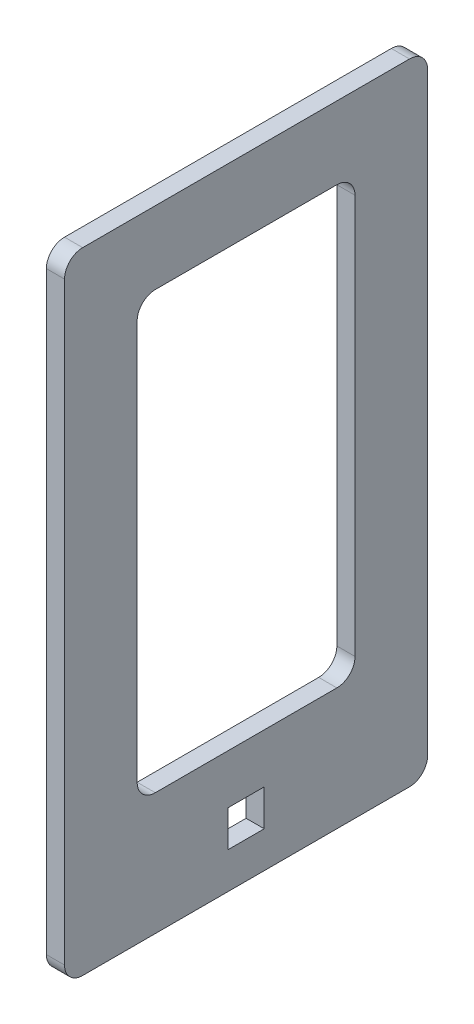
ISO-10303-21;
HEADER;
FILE_DESCRIPTION(('STEP AP214'),'2;1');
FILE_NAME('part.step','',(''),(''),'','','');
FILE_SCHEMA(('AUTOMOTIVE_DESIGN { 1 0 10303 214 1 1 1 1 }'));
ENDSEC;
DATA;
#1=APPLICATION_CONTEXT('core data for automotive mechanical design processes');
#2=APPLICATION_PROTOCOL_DEFINITION('international standard','automotive_design',2000,#1);
#3=PRODUCT_CONTEXT('',#1,'mechanical');
#4=PRODUCT('Part','Part','',(#3));
#5=PRODUCT_RELATED_PRODUCT_CATEGORY('part','',(#4));
#6=PRODUCT_DEFINITION_FORMATION('','',#4);
#7=PRODUCT_DEFINITION_CONTEXT('part definition',#1,'design');
#8=PRODUCT_DEFINITION('design','',#6,#7);
#9=PRODUCT_DEFINITION_SHAPE('','',#8);
#10=(LENGTH_UNIT() NAMED_UNIT(*) SI_UNIT(.MILLI.,.METRE.));
#11=(NAMED_UNIT(*) PLANE_ANGLE_UNIT() SI_UNIT($,.RADIAN.));
#12=(NAMED_UNIT(*) SI_UNIT($,.STERADIAN.) SOLID_ANGLE_UNIT());
#13=UNCERTAINTY_MEASURE_WITH_UNIT(LENGTH_MEASURE(1.E-05),#10,'distance_accuracy_value','');
#14=(GEOMETRIC_REPRESENTATION_CONTEXT(3) GLOBAL_UNCERTAINTY_ASSIGNED_CONTEXT((#13)) GLOBAL_UNIT_ASSIGNED_CONTEXT((#10,
#11,#12)) REPRESENTATION_CONTEXT('',''));
#15=CARTESIAN_POINT('',(0.,0.,0.));
#16=DIRECTION('',(0.,0.,1.));
#17=DIRECTION('',(1.,0.,0.));
#18=AXIS2_PLACEMENT_3D('',#15,#16,#17);
#19=CARTESIAN_POINT('',(6.35,-103.886,57.15));
#20=DIRECTION('',(-1.,0.,0.));
#21=DIRECTION('',(0.,0.,1.));
#22=AXIS2_PLACEMENT_3D('',#19,#20,#21);
#23=PLANE('',#22);
#24=DIRECTION('',(0.,0.,1.));
#25=VECTOR('',#24,1.);
#26=CARTESIAN_POINT('',(6.35,-84.836,6.35000000000005));
#27=LINE('',#26,#25);
#28=CARTESIAN_POINT('',(6.35,-84.836,-6.34999999999995));
#29=VERTEX_POINT('',#28);
#30=CARTESIAN_POINT('',(6.35,-84.836,6.35000000000005));
#31=VERTEX_POINT('',#30);
#32=EDGE_CURVE('E201',#29,#31,#27,.T.);
#33=ORIENTED_EDGE('',*,*,#32,.F.);
#34=DIRECTION('',(0.,1.,0.));
#35=VECTOR('',#34,1.);
#36=CARTESIAN_POINT('',(6.35,-97.536,-6.34999999999995));
#37=LINE('',#36,#35);
#38=CARTESIAN_POINT('',(6.35,-97.536,-6.34999999999995));
#39=VERTEX_POINT('',#38);
#40=EDGE_CURVE('E55',#39,#29,#37,.T.);
#41=ORIENTED_EDGE('',*,*,#40,.F.);
#42=DIRECTION('',(0.,0.,-1.));
#43=VECTOR('',#42,1.);
#44=CARTESIAN_POINT('',(6.35,-97.536,6.35000000000005));
#45=LINE('',#44,#43);
#46=CARTESIAN_POINT('',(6.35,-97.536,6.35000000000005));
#47=VERTEX_POINT('',#46);
#48=EDGE_CURVE('E191',#47,#39,#45,.T.);
#49=ORIENTED_EDGE('',*,*,#48,.F.);
#50=DIRECTION('',(0.,-1.,0.));
#51=VECTOR('',#50,1.);
#52=CARTESIAN_POINT('',(6.35,-97.536,6.35000000000005));
#53=LINE('',#52,#51);
#54=EDGE_CURVE('E209',#31,#47,#53,.T.);
#55=ORIENTED_EDGE('',*,*,#54,.F.);
#56=EDGE_LOOP('',(#33,#41,#49,#55));
#57=FACE_BOUND('',#56,.T.);
#58=CARTESIAN_POINT('',(6.35,-103.886,57.15));
#59=DIRECTION('',(1.,0.,0.));
#60=DIRECTION('',(0.,0.,1.));
#61=AXIS2_PLACEMENT_3D('',#58,#59,#60);
#62=CIRCLE('',#61,6.35);
#63=CARTESIAN_POINT('',(6.35,-103.886,63.5));
#64=VERTEX_POINT('',#63);
#65=CARTESIAN_POINT('',(6.35,-110.236,57.15));
#66=VERTEX_POINT('',#65);
#67=EDGE_CURVE('E306',#64,#66,#62,.T.);
#68=ORIENTED_EDGE('',*,*,#67,.T.);
#69=DIRECTION('',(0.,0.,-1.));
#70=VECTOR('',#69,1.);
#71=CARTESIAN_POINT('',(6.35,-110.236,57.15));
#72=LINE('',#71,#70);
#73=CARTESIAN_POINT('',(6.35,-110.236,-57.15));
#74=VERTEX_POINT('',#73);
#75=EDGE_CURVE('E310',#66,#74,#72,.T.);
#76=ORIENTED_EDGE('',*,*,#75,.T.);
#77=CARTESIAN_POINT('',(6.35,-103.886,-57.15));
#78=DIRECTION('',(1.,0.,0.));
#79=DIRECTION('',(0.,0.,1.));
#80=AXIS2_PLACEMENT_3D('',#77,#78,#79);
#81=CIRCLE('',#80,6.35);
#82=CARTESIAN_POINT('',(6.35,-103.886,-63.5));
#83=VERTEX_POINT('',#82);
#84=EDGE_CURVE('E314',#74,#83,#81,.T.);
#85=ORIENTED_EDGE('',*,*,#84,.T.);
#86=DIRECTION('',(0.,1.,0.));
#87=VECTOR('',#86,1.);
#88=CARTESIAN_POINT('',(6.35,-103.886,-63.5));
#89=LINE('',#88,#87);
#90=CARTESIAN_POINT('',(6.35,103.886,-63.5));
#91=VERTEX_POINT('',#90);
#92=EDGE_CURVE('E317',#83,#91,#89,.T.);
#93=ORIENTED_EDGE('',*,*,#92,.T.);
#94=CARTESIAN_POINT('',(6.35,103.886,-57.15));
#95=DIRECTION('',(1.,0.,0.));
#96=DIRECTION('',(0.,0.,-1.));
#97=AXIS2_PLACEMENT_3D('',#94,#95,#96);
#98=CIRCLE('',#97,6.35);
#99=CARTESIAN_POINT('',(6.35,110.236,-57.15));
#100=VERTEX_POINT('',#99);
#101=EDGE_CURVE('E320',#91,#100,#98,.T.);
#102=ORIENTED_EDGE('',*,*,#101,.T.);
#103=DIRECTION('',(0.,0.,1.));
#104=VECTOR('',#103,1.);
#105=CARTESIAN_POINT('',(6.35,110.236,57.15));
#106=LINE('',#105,#104);
#107=CARTESIAN_POINT('',(6.35,110.236,57.15));
#108=VERTEX_POINT('',#107);
#109=EDGE_CURVE('E323',#100,#108,#106,.T.);
#110=ORIENTED_EDGE('',*,*,#109,.T.);
#111=CARTESIAN_POINT('',(6.35,103.886,57.15));
#112=DIRECTION('',(1.,0.,0.));
#113=DIRECTION('',(0.,0.,1.));
#114=AXIS2_PLACEMENT_3D('',#111,#112,#113);
#115=CIRCLE('',#114,6.35);
#116=CARTESIAN_POINT('',(6.35,103.886,63.5));
#117=VERTEX_POINT('',#116);
#118=EDGE_CURVE('E326',#108,#117,#115,.T.);
#119=ORIENTED_EDGE('',*,*,#118,.T.);
#120=DIRECTION('',(0.,-1.,0.));
#121=VECTOR('',#120,1.);
#122=CARTESIAN_POINT('',(6.35,-103.886,63.5));
#123=LINE('',#122,#121);
#124=EDGE_CURVE('E329',#117,#64,#123,.T.);
#125=ORIENTED_EDGE('',*,*,#124,.T.);
#126=EDGE_LOOP('',(#68,#76,#85,#93,#102,#110,#119,#125));
#127=FACE_BOUND('',#126,.T.);
#128=CARTESIAN_POINT('',(6.35,-61.214,-31.75));
#129=DIRECTION('',(1.,0.,0.));
#130=DIRECTION('',(0.,0.,-1.));
#131=AXIS2_PLACEMENT_3D('',#128,#129,#130);
#132=CIRCLE('',#131,6.35000000000001);
#133=CARTESIAN_POINT('',(6.35,-67.564,-31.75));
#134=VERTEX_POINT('',#133);
#135=CARTESIAN_POINT('',(6.35,-61.214,-38.1));
#136=VERTEX_POINT('',#135);
#137=EDGE_CURVE('E223',#134,#136,#132,.T.);
#138=ORIENTED_EDGE('',*,*,#137,.F.);
#139=DIRECTION('',(0.,0.,-1.));
#140=VECTOR('',#139,1.);
#141=CARTESIAN_POINT('',(6.35,-67.564,31.75));
#142=LINE('',#141,#140);
#143=CARTESIAN_POINT('',(6.35,-67.564,31.75));
#144=VERTEX_POINT('',#143);
#145=EDGE_CURVE('E246',#144,#134,#142,.T.);
#146=ORIENTED_EDGE('',*,*,#145,.F.);
#147=CARTESIAN_POINT('',(6.35,-61.214,31.75));
#148=DIRECTION('',(1.,0.,0.));
#149=DIRECTION('',(0.,0.,1.));
#150=AXIS2_PLACEMENT_3D('',#147,#148,#149);
#151=CIRCLE('',#150,6.35);
#152=CARTESIAN_POINT('',(6.35,-61.214,38.1));
#153=VERTEX_POINT('',#152);
#154=EDGE_CURVE('E242',#153,#144,#151,.T.);
#155=ORIENTED_EDGE('',*,*,#154,.F.);
#156=DIRECTION('',(0.,-1.,0.));
#157=VECTOR('',#156,1.);
#158=CARTESIAN_POINT('',(6.35,-61.214,38.1));
#159=LINE('',#158,#157);
#160=CARTESIAN_POINT('',(6.35,78.486,38.1));
#161=VERTEX_POINT('',#160);
#162=EDGE_CURVE('E239',#161,#153,#159,.T.);
#163=ORIENTED_EDGE('',*,*,#162,.F.);
#164=CARTESIAN_POINT('',(6.35,78.486,31.75));
#165=DIRECTION('',(1.,0.,0.));
#166=DIRECTION('',(0.,0.,1.));
#167=AXIS2_PLACEMENT_3D('',#164,#165,#166);
#168=CIRCLE('',#167,6.35);
#169=CARTESIAN_POINT('',(6.35,84.836,31.75));
#170=VERTEX_POINT('',#169);
#171=EDGE_CURVE('E236',#170,#161,#168,.T.);
#172=ORIENTED_EDGE('',*,*,#171,.F.);
#173=DIRECTION('',(0.,0.,1.));
#174=VECTOR('',#173,1.);
#175=CARTESIAN_POINT('',(6.35,84.836,31.75));
#176=LINE('',#175,#174);
#177=CARTESIAN_POINT('',(6.35,84.836,-31.75));
#178=VERTEX_POINT('',#177);
#179=EDGE_CURVE('E233',#178,#170,#176,.T.);
#180=ORIENTED_EDGE('',*,*,#179,.F.);
#181=CARTESIAN_POINT('',(6.35,78.486,-31.75));
#182=DIRECTION('',(1.,0.,0.));
#183=DIRECTION('',(0.,0.,1.));
#184=AXIS2_PLACEMENT_3D('',#181,#182,#183);
#185=CIRCLE('',#184,6.35);
#186=CARTESIAN_POINT('',(6.35,78.486,-38.1));
#187=VERTEX_POINT('',#186);
#188=EDGE_CURVE('E230',#187,#178,#185,.T.);
#189=ORIENTED_EDGE('',*,*,#188,.F.);
#190=DIRECTION('',(0.,1.,0.));
#191=VECTOR('',#190,1.);
#192=CARTESIAN_POINT('',(6.35,-61.214,-38.1));
#193=LINE('',#192,#191);
#194=EDGE_CURVE('E226',#136,#187,#193,.T.);
#195=ORIENTED_EDGE('',*,*,#194,.F.);
#196=EDGE_LOOP('',(#138,#146,#155,#163,#172,#180,#189,#195));
#197=FACE_BOUND('',#196,.T.);
#198=ADVANCED_FACE('F39',(#57,#127,#197),#23,.F.);
#199=CARTESIAN_POINT('',(0.,-103.886,57.15));
#200=DIRECTION('',(-1.,0.,0.));
#201=DIRECTION('',(0.,0.,1.));
#202=AXIS2_PLACEMENT_3D('',#199,#200,#201);
#203=PLANE('',#202);
#204=DIRECTION('',(0.,1.,0.));
#205=VECTOR('',#204,1.);
#206=CARTESIAN_POINT('',(0.,-97.536,-6.34999999999995));
#207=LINE('',#206,#205);
#208=CARTESIAN_POINT('',(0.,-97.536,-6.34999999999995));
#209=VERTEX_POINT('',#208);
#210=CARTESIAN_POINT('',(0.,-84.836,-6.34999999999995));
#211=VERTEX_POINT('',#210);
#212=EDGE_CURVE('E188',#209,#211,#207,.T.);
#213=ORIENTED_EDGE('',*,*,#212,.T.);
#214=DIRECTION('',(0.,0.,1.));
#215=VECTOR('',#214,1.);
#216=CARTESIAN_POINT('',(0.,-84.836,6.35000000000005));
#217=LINE('',#216,#215);
#218=CARTESIAN_POINT('',(0.,-84.836,6.35000000000004));
#219=VERTEX_POINT('',#218);
#220=EDGE_CURVE('E176',#211,#219,#217,.T.);
#221=ORIENTED_EDGE('',*,*,#220,.T.);
#222=DIRECTION('',(0.,-1.,0.));
#223=VECTOR('',#222,1.);
#224=CARTESIAN_POINT('',(0.,-97.536,6.35000000000005));
#225=LINE('',#224,#223);
#226=CARTESIAN_POINT('',(0.,-97.536,6.35000000000005));
#227=VERTEX_POINT('',#226);
#228=EDGE_CURVE('E203',#219,#227,#225,.T.);
#229=ORIENTED_EDGE('',*,*,#228,.T.);
#230=DIRECTION('',(0.,0.,-1.));
#231=VECTOR('',#230,1.);
#232=CARTESIAN_POINT('',(0.,-97.536,6.35000000000005));
#233=LINE('',#232,#231);
#234=EDGE_CURVE('E196',#227,#209,#233,.T.);
#235=ORIENTED_EDGE('',*,*,#234,.T.);
#236=EDGE_LOOP('',(#213,#221,#229,#235));
#237=FACE_BOUND('',#236,.T.);
#238=CARTESIAN_POINT('',(0.,-103.886,57.15));
#239=DIRECTION('',(1.,0.,0.));
#240=DIRECTION('',(0.,0.,1.));
#241=AXIS2_PLACEMENT_3D('',#238,#239,#240);
#242=CIRCLE('',#241,6.35);
#243=CARTESIAN_POINT('',(0.,-103.886,63.5));
#244=VERTEX_POINT('',#243);
#245=CARTESIAN_POINT('',(0.,-110.236,57.15));
#246=VERTEX_POINT('',#245);
#247=EDGE_CURVE('E305',#244,#246,#242,.T.);
#248=ORIENTED_EDGE('',*,*,#247,.F.);
#249=DIRECTION('',(0.,-1.,0.));
#250=VECTOR('',#249,1.);
#251=CARTESIAN_POINT('',(0.,-103.886,63.5));
#252=LINE('',#251,#250);
#253=CARTESIAN_POINT('',(0.,103.886,63.5));
#254=VERTEX_POINT('',#253);
#255=EDGE_CURVE('E311',#254,#244,#252,.T.);
#256=ORIENTED_EDGE('',*,*,#255,.F.);
#257=CARTESIAN_POINT('',(0.,103.886,57.15));
#258=DIRECTION('',(1.,0.,0.));
#259=DIRECTION('',(0.,0.,1.));
#260=AXIS2_PLACEMENT_3D('',#257,#258,#259);
#261=CIRCLE('',#260,6.35);
#262=CARTESIAN_POINT('',(0.,110.236,57.15));
#263=VERTEX_POINT('',#262);
#264=EDGE_CURVE('E351',#263,#254,#261,.T.);
#265=ORIENTED_EDGE('',*,*,#264,.F.);
#266=DIRECTION('',(0.,0.,1.));
#267=VECTOR('',#266,1.);
#268=CARTESIAN_POINT('',(0.,110.236,57.15));
#269=LINE('',#268,#267);
#270=CARTESIAN_POINT('',(0.,110.236,-57.15));
#271=VERTEX_POINT('',#270);
#272=EDGE_CURVE('E348',#271,#263,#269,.T.);
#273=ORIENTED_EDGE('',*,*,#272,.F.);
#274=CARTESIAN_POINT('',(0.,103.886,-57.15));
#275=DIRECTION('',(1.,0.,0.));
#276=DIRECTION('',(0.,0.,-1.));
#277=AXIS2_PLACEMENT_3D('',#274,#275,#276);
#278=CIRCLE('',#277,6.35);
#279=CARTESIAN_POINT('',(0.,103.886,-63.5));
#280=VERTEX_POINT('',#279);
#281=EDGE_CURVE('E345',#280,#271,#278,.T.);
#282=ORIENTED_EDGE('',*,*,#281,.F.);
#283=DIRECTION('',(0.,1.,0.));
#284=VECTOR('',#283,1.);
#285=CARTESIAN_POINT('',(0.,-103.886,-63.5));
#286=LINE('',#285,#284);
#287=CARTESIAN_POINT('',(0.,-103.886,-63.5));
#288=VERTEX_POINT('',#287);
#289=EDGE_CURVE('E342',#288,#280,#286,.T.);
#290=ORIENTED_EDGE('',*,*,#289,.F.);
#291=CARTESIAN_POINT('',(0.,-103.886,-57.15));
#292=DIRECTION('',(1.,0.,0.));
#293=DIRECTION('',(0.,0.,1.));
#294=AXIS2_PLACEMENT_3D('',#291,#292,#293);
#295=CIRCLE('',#294,6.35);
#296=CARTESIAN_POINT('',(0.,-110.236,-57.15));
#297=VERTEX_POINT('',#296);
#298=EDGE_CURVE('E339',#297,#288,#295,.T.);
#299=ORIENTED_EDGE('',*,*,#298,.F.);
#300=DIRECTION('',(0.,0.,-1.));
#301=VECTOR('',#300,1.);
#302=CARTESIAN_POINT('',(0.,-110.236,57.15));
#303=LINE('',#302,#301);
#304=EDGE_CURVE('E336',#246,#297,#303,.T.);
#305=ORIENTED_EDGE('',*,*,#304,.F.);
#306=EDGE_LOOP('',(#248,#256,#265,#273,#282,#290,#299,#305));
#307=FACE_BOUND('',#306,.T.);
#308=DIRECTION('',(0.,0.,-1.));
#309=VECTOR('',#308,1.);
#310=CARTESIAN_POINT('',(0.,-67.564,31.75));
#311=LINE('',#310,#309);
#312=CARTESIAN_POINT('',(0.,-67.564,31.75));
#313=VERTEX_POINT('',#312);
#314=CARTESIAN_POINT('',(0.,-67.564,-31.75));
#315=VERTEX_POINT('',#314);
#316=EDGE_CURVE('E227',#313,#315,#311,.T.);
#317=ORIENTED_EDGE('',*,*,#316,.T.);
#318=CARTESIAN_POINT('',(0.,-61.214,-31.75));
#319=DIRECTION('',(1.,0.,0.));
#320=DIRECTION('',(0.,0.,-1.));
#321=AXIS2_PLACEMENT_3D('',#318,#319,#320);
#322=CIRCLE('',#321,6.35000000000001);
#323=CARTESIAN_POINT('',(0.,-61.214,-38.1));
#324=VERTEX_POINT('',#323);
#325=EDGE_CURVE('E184',#315,#324,#322,.T.);
#326=ORIENTED_EDGE('',*,*,#325,.T.);
#327=DIRECTION('',(0.,1.,0.));
#328=VECTOR('',#327,1.);
#329=CARTESIAN_POINT('',(0.,-61.214,-38.1));
#330=LINE('',#329,#328);
#331=CARTESIAN_POINT('',(0.,78.486,-38.1));
#332=VERTEX_POINT('',#331);
#333=EDGE_CURVE('E253',#324,#332,#330,.T.);
#334=ORIENTED_EDGE('',*,*,#333,.T.);
#335=CARTESIAN_POINT('',(0.,78.486,-31.75));
#336=DIRECTION('',(1.,0.,0.));
#337=DIRECTION('',(0.,0.,1.));
#338=AXIS2_PLACEMENT_3D('',#335,#336,#337);
#339=CIRCLE('',#338,6.35);
#340=CARTESIAN_POINT('',(0.,84.836,-31.75));
#341=VERTEX_POINT('',#340);
#342=EDGE_CURVE('E257',#332,#341,#339,.T.);
#343=ORIENTED_EDGE('',*,*,#342,.T.);
#344=DIRECTION('',(0.,0.,1.));
#345=VECTOR('',#344,1.);
#346=CARTESIAN_POINT('',(0.,84.836,31.75));
#347=LINE('',#346,#345);
#348=CARTESIAN_POINT('',(0.,84.836,31.75));
#349=VERTEX_POINT('',#348);
#350=EDGE_CURVE('E261',#341,#349,#347,.T.);
#351=ORIENTED_EDGE('',*,*,#350,.T.);
#352=CARTESIAN_POINT('',(0.,78.486,31.75));
#353=DIRECTION('',(1.,0.,0.));
#354=DIRECTION('',(0.,0.,1.));
#355=AXIS2_PLACEMENT_3D('',#352,#353,#354);
#356=CIRCLE('',#355,6.35);
#357=CARTESIAN_POINT('',(0.,78.486,38.1));
#358=VERTEX_POINT('',#357);
#359=EDGE_CURVE('E265',#349,#358,#356,.T.);
#360=ORIENTED_EDGE('',*,*,#359,.T.);
#361=DIRECTION('',(0.,-1.,0.));
#362=VECTOR('',#361,1.);
#363=CARTESIAN_POINT('',(0.,-61.214,38.1));
#364=LINE('',#363,#362);
#365=CARTESIAN_POINT('',(0.,-61.214,38.1));
#366=VERTEX_POINT('',#365);
#367=EDGE_CURVE('E269',#358,#366,#364,.T.);
#368=ORIENTED_EDGE('',*,*,#367,.T.);
#369=CARTESIAN_POINT('',(0.,-61.214,31.75));
#370=DIRECTION('',(1.,0.,0.));
#371=DIRECTION('',(0.,0.,1.));
#372=AXIS2_PLACEMENT_3D('',#369,#370,#371);
#373=CIRCLE('',#372,6.35);
#374=EDGE_CURVE('E273',#366,#313,#373,.T.);
#375=ORIENTED_EDGE('',*,*,#374,.T.);
#376=EDGE_LOOP('',(#317,#326,#334,#343,#351,#360,#368,#375));
#377=FACE_BOUND('',#376,.T.);
#378=ADVANCED_FACE('F194',(#237,#307,#377),#203,.T.);
#379=CARTESIAN_POINT('',(6.35,-103.886,57.15));
#380=DIRECTION('',(-1.,0.,0.));
#381=DIRECTION('',(0.,0.,1.));
#382=AXIS2_PLACEMENT_3D('',#379,#380,#381);
#383=CYLINDRICAL_SURFACE('',#382,6.35);
#384=ORIENTED_EDGE('',*,*,#247,.T.);
#385=DIRECTION('',(-1.,0.,0.));
#386=VECTOR('',#385,1.);
#387=CARTESIAN_POINT('',(6.35,-110.236,57.15));
#388=LINE('',#387,#386);
#389=EDGE_CURVE('E11',#66,#246,#388,.T.);
#390=ORIENTED_EDGE('',*,*,#389,.F.);
#391=ORIENTED_EDGE('',*,*,#67,.F.);
#392=DIRECTION('',(-1.,0.,0.));
#393=VECTOR('',#392,1.);
#394=CARTESIAN_POINT('',(6.35,-103.886,63.5));
#395=LINE('',#394,#393);
#396=EDGE_CURVE('E332',#64,#244,#395,.T.);
#397=ORIENTED_EDGE('',*,*,#396,.T.);
#398=EDGE_LOOP('',(#384,#390,#391,#397));
#399=FACE_BOUND('',#398,.T.);
#400=ADVANCED_FACE('F41',(#399),#383,.T.);
#401=CARTESIAN_POINT('',(6.35,-110.236,57.15));
#402=DIRECTION('',(0.,1.,0.));
#403=DIRECTION('',(0.,0.,1.));
#404=AXIS2_PLACEMENT_3D('',#401,#402,#403);
#405=PLANE('',#404);
#406=ORIENTED_EDGE('',*,*,#304,.T.);
#407=DIRECTION('',(-1.,0.,0.));
#408=VECTOR('',#407,1.);
#409=CARTESIAN_POINT('',(6.35,-110.236,-57.15));
#410=LINE('',#409,#408);
#411=EDGE_CURVE('E48',#74,#297,#410,.T.);
#412=ORIENTED_EDGE('',*,*,#411,.F.);
#413=ORIENTED_EDGE('',*,*,#75,.F.);
#414=ORIENTED_EDGE('',*,*,#389,.T.);
#415=EDGE_LOOP('',(#406,#412,#413,#414));
#416=FACE_BOUND('',#415,.T.);
#417=ADVANCED_FACE('F406',(#416),#405,.F.);
#418=CARTESIAN_POINT('',(6.35,-103.886,-57.15));
#419=DIRECTION('',(-1.,0.,0.));
#420=DIRECTION('',(0.,0.,1.));
#421=AXIS2_PLACEMENT_3D('',#418,#419,#420);
#422=CYLINDRICAL_SURFACE('',#421,6.35);
#423=ORIENTED_EDGE('',*,*,#298,.T.);
#424=DIRECTION('',(-1.,0.,0.));
#425=VECTOR('',#424,1.);
#426=CARTESIAN_POINT('',(6.35,-103.886,-63.5));
#427=LINE('',#426,#425);
#428=EDGE_CURVE('E375',#83,#288,#427,.T.);
#429=ORIENTED_EDGE('',*,*,#428,.F.);
#430=ORIENTED_EDGE('',*,*,#84,.F.);
#431=ORIENTED_EDGE('',*,*,#411,.T.);
#432=EDGE_LOOP('',(#423,#429,#430,#431));
#433=FACE_BOUND('',#432,.T.);
#434=ADVANCED_FACE('F384',(#433),#422,.T.);
#435=CARTESIAN_POINT('',(6.35,-103.886,-63.5));
#436=DIRECTION('',(0.,0.,1.));
#437=DIRECTION('',(1.,0.,0.));
#438=AXIS2_PLACEMENT_3D('',#435,#436,#437);
#439=PLANE('',#438);
#440=ORIENTED_EDGE('',*,*,#289,.T.);
#441=DIRECTION('',(-1.,0.,0.));
#442=VECTOR('',#441,1.);
#443=CARTESIAN_POINT('',(6.35,103.886,-63.5));
#444=LINE('',#443,#442);
#445=EDGE_CURVE('E371',#91,#280,#444,.T.);
#446=ORIENTED_EDGE('',*,*,#445,.F.);
#447=ORIENTED_EDGE('',*,*,#92,.F.);
#448=ORIENTED_EDGE('',*,*,#428,.T.);
#449=EDGE_LOOP('',(#440,#446,#447,#448));
#450=FACE_BOUND('',#449,.T.);
#451=ADVANCED_FACE('F394',(#450),#439,.F.);
#452=CARTESIAN_POINT('',(6.35,103.886,-57.15));
#453=DIRECTION('',(-1.,0.,0.));
#454=DIRECTION('',(0.,0.,1.));
#455=AXIS2_PLACEMENT_3D('',#452,#453,#454);
#456=CYLINDRICAL_SURFACE('',#455,6.35);
#457=ORIENTED_EDGE('',*,*,#281,.T.);
#458=DIRECTION('',(-1.,0.,0.));
#459=VECTOR('',#458,1.);
#460=CARTESIAN_POINT('',(6.35,110.236,-57.15));
#461=LINE('',#460,#459);
#462=EDGE_CURVE('E367',#100,#271,#461,.T.);
#463=ORIENTED_EDGE('',*,*,#462,.F.);
#464=ORIENTED_EDGE('',*,*,#101,.F.);
#465=ORIENTED_EDGE('',*,*,#445,.T.);
#466=EDGE_LOOP('',(#457,#463,#464,#465));
#467=FACE_BOUND('',#466,.T.);
#468=ADVANCED_FACE('F398',(#467),#456,.T.);
#469=CARTESIAN_POINT('',(6.35,110.236,57.15));
#470=DIRECTION('',(0.,-1.,0.));
#471=DIRECTION('',(0.,0.,-1.));
#472=AXIS2_PLACEMENT_3D('',#469,#470,#471);
#473=PLANE('',#472);
#474=ORIENTED_EDGE('',*,*,#272,.T.);
#475=DIRECTION('',(-1.,0.,0.));
#476=VECTOR('',#475,1.);
#477=CARTESIAN_POINT('',(6.35,110.236,57.15));
#478=LINE('',#477,#476);
#479=EDGE_CURVE('E363',#108,#263,#478,.T.);
#480=ORIENTED_EDGE('',*,*,#479,.F.);
#481=ORIENTED_EDGE('',*,*,#109,.F.);
#482=ORIENTED_EDGE('',*,*,#462,.T.);
#483=EDGE_LOOP('',(#474,#480,#481,#482));
#484=FACE_BOUND('',#483,.T.);
#485=ADVANCED_FACE('F419',(#484),#473,.F.);
#486=CARTESIAN_POINT('',(6.35,103.886,57.15));
#487=DIRECTION('',(-1.,0.,0.));
#488=DIRECTION('',(0.,0.,1.));
#489=AXIS2_PLACEMENT_3D('',#486,#487,#488);
#490=CYLINDRICAL_SURFACE('',#489,6.35);
#491=ORIENTED_EDGE('',*,*,#264,.T.);
#492=DIRECTION('',(-1.,0.,0.));
#493=VECTOR('',#492,1.);
#494=CARTESIAN_POINT('',(6.35,103.886,63.5));
#495=LINE('',#494,#493);
#496=EDGE_CURVE('E359',#117,#254,#495,.T.);
#497=ORIENTED_EDGE('',*,*,#496,.F.);
#498=ORIENTED_EDGE('',*,*,#118,.F.);
#499=ORIENTED_EDGE('',*,*,#479,.T.);
#500=EDGE_LOOP('',(#491,#497,#498,#499));
#501=FACE_BOUND('',#500,.T.);
#502=ADVANCED_FACE('F417',(#501),#490,.T.);
#503=CARTESIAN_POINT('',(6.35,-103.886,63.5));
#504=DIRECTION('',(0.,0.,-1.));
#505=DIRECTION('',(-1.,0.,0.));
#506=AXIS2_PLACEMENT_3D('',#503,#504,#505);
#507=PLANE('',#506);
#508=ORIENTED_EDGE('',*,*,#255,.T.);
#509=ORIENTED_EDGE('',*,*,#396,.F.);
#510=ORIENTED_EDGE('',*,*,#124,.F.);
#511=ORIENTED_EDGE('',*,*,#496,.T.);
#512=EDGE_LOOP('',(#508,#509,#510,#511));
#513=FACE_BOUND('',#512,.T.);
#514=ADVANCED_FACE('F412',(#513),#507,.F.);
#515=CARTESIAN_POINT('',(6.35,-61.214,-31.75));
#516=DIRECTION('',(-1.,0.,0.));
#517=DIRECTION('',(0.,0.,1.));
#518=AXIS2_PLACEMENT_3D('',#515,#516,#517);
#519=CYLINDRICAL_SURFACE('',#518,6.35000000000001);
#520=ORIENTED_EDGE('',*,*,#325,.F.);
#521=DIRECTION('',(-1.,0.,0.));
#522=VECTOR('',#521,1.);
#523=CARTESIAN_POINT('',(6.35,-67.564,-31.75));
#524=LINE('',#523,#522);
#525=EDGE_CURVE('E249',#134,#315,#524,.T.);
#526=ORIENTED_EDGE('',*,*,#525,.F.);
#527=ORIENTED_EDGE('',*,*,#137,.T.);
#528=DIRECTION('',(-1.,0.,0.));
#529=VECTOR('',#528,1.);
#530=CARTESIAN_POINT('',(6.35,-61.214,-38.1));
#531=LINE('',#530,#529);
#532=EDGE_CURVE('E301',#136,#324,#531,.T.);
#533=ORIENTED_EDGE('',*,*,#532,.T.);
#534=EDGE_LOOP('',(#520,#526,#527,#533));
#535=FACE_BOUND('',#534,.T.);
#536=ADVANCED_FACE('F436',(#535),#519,.F.);
#537=CARTESIAN_POINT('',(6.35,-61.214,-38.1));
#538=DIRECTION('',(0.,0.,1.));
#539=DIRECTION('',(0.,-1.,0.));
#540=AXIS2_PLACEMENT_3D('',#537,#538,#539);
#541=PLANE('',#540);
#542=ORIENTED_EDGE('',*,*,#333,.F.);
#543=ORIENTED_EDGE('',*,*,#532,.F.);
#544=ORIENTED_EDGE('',*,*,#194,.T.);
#545=DIRECTION('',(-1.,0.,0.));
#546=VECTOR('',#545,1.);
#547=CARTESIAN_POINT('',(6.35,78.486,-38.1));
#548=LINE('',#547,#546);
#549=EDGE_CURVE('E298',#187,#332,#548,.T.);
#550=ORIENTED_EDGE('',*,*,#549,.T.);
#551=EDGE_LOOP('',(#542,#543,#544,#550));
#552=FACE_BOUND('',#551,.T.);
#553=ADVANCED_FACE('F443',(#552),#541,.T.);
#554=CARTESIAN_POINT('',(6.35,78.486,-31.75));
#555=DIRECTION('',(-1.,0.,0.));
#556=DIRECTION('',(0.,0.,1.));
#557=AXIS2_PLACEMENT_3D('',#554,#555,#556);
#558=CYLINDRICAL_SURFACE('',#557,6.35);
#559=ORIENTED_EDGE('',*,*,#342,.F.);
#560=ORIENTED_EDGE('',*,*,#549,.F.);
#561=ORIENTED_EDGE('',*,*,#188,.T.);
#562=DIRECTION('',(-1.,0.,0.));
#563=VECTOR('',#562,1.);
#564=CARTESIAN_POINT('',(6.35,84.836,-31.75));
#565=LINE('',#564,#563);
#566=EDGE_CURVE('E295',#178,#341,#565,.T.);
#567=ORIENTED_EDGE('',*,*,#566,.T.);
#568=EDGE_LOOP('',(#559,#560,#561,#567));
#569=FACE_BOUND('',#568,.T.);
#570=ADVANCED_FACE('F448',(#569),#558,.F.);
#571=CARTESIAN_POINT('',(6.35,84.836,31.75));
#572=DIRECTION('',(0.,-1.,0.));
#573=DIRECTION('',(0.,0.,-1.));
#574=AXIS2_PLACEMENT_3D('',#571,#572,#573);
#575=PLANE('',#574);
#576=ORIENTED_EDGE('',*,*,#350,.F.);
#577=ORIENTED_EDGE('',*,*,#566,.F.);
#578=ORIENTED_EDGE('',*,*,#179,.T.);
#579=DIRECTION('',(-1.,0.,0.));
#580=VECTOR('',#579,1.);
#581=CARTESIAN_POINT('',(6.35,84.836,31.75));
#582=LINE('',#581,#580);
#583=EDGE_CURVE('E292',#170,#349,#582,.T.);
#584=ORIENTED_EDGE('',*,*,#583,.T.);
#585=EDGE_LOOP('',(#576,#577,#578,#584));
#586=FACE_BOUND('',#585,.T.);
#587=ADVANCED_FACE('F473',(#586),#575,.T.);
#588=CARTESIAN_POINT('',(6.35,78.486,31.75));
#589=DIRECTION('',(-1.,0.,0.));
#590=DIRECTION('',(0.,0.,1.));
#591=AXIS2_PLACEMENT_3D('',#588,#589,#590);
#592=CYLINDRICAL_SURFACE('',#591,6.35);
#593=ORIENTED_EDGE('',*,*,#359,.F.);
#594=ORIENTED_EDGE('',*,*,#583,.F.);
#595=ORIENTED_EDGE('',*,*,#171,.T.);
#596=DIRECTION('',(-1.,0.,0.));
#597=VECTOR('',#596,1.);
#598=CARTESIAN_POINT('',(6.35,78.486,38.1));
#599=LINE('',#598,#597);
#600=EDGE_CURVE('E289',#161,#358,#599,.T.);
#601=ORIENTED_EDGE('',*,*,#600,.T.);
#602=EDGE_LOOP('',(#593,#594,#595,#601));
#603=FACE_BOUND('',#602,.T.);
#604=ADVANCED_FACE('F478',(#603),#592,.F.);
#605=CARTESIAN_POINT('',(6.35,-61.214,38.1));
#606=DIRECTION('',(0.,0.,-1.));
#607=DIRECTION('',(-1.,0.,0.));
#608=AXIS2_PLACEMENT_3D('',#605,#606,#607);
#609=PLANE('',#608);
#610=ORIENTED_EDGE('',*,*,#367,.F.);
#611=ORIENTED_EDGE('',*,*,#600,.F.);
#612=ORIENTED_EDGE('',*,*,#162,.T.);
#613=DIRECTION('',(-1.,0.,0.));
#614=VECTOR('',#613,1.);
#615=CARTESIAN_POINT('',(6.35,-61.214,38.1));
#616=LINE('',#615,#614);
#617=EDGE_CURVE('E286',#153,#366,#616,.T.);
#618=ORIENTED_EDGE('',*,*,#617,.T.);
#619=EDGE_LOOP('',(#610,#611,#612,#618));
#620=FACE_BOUND('',#619,.T.);
#621=ADVANCED_FACE('F481',(#620),#609,.T.);
#622=CARTESIAN_POINT('',(6.35,-61.214,31.75));
#623=DIRECTION('',(-1.,0.,0.));
#624=DIRECTION('',(0.,0.,1.));
#625=AXIS2_PLACEMENT_3D('',#622,#623,#624);
#626=CYLINDRICAL_SURFACE('',#625,6.35);
#627=ORIENTED_EDGE('',*,*,#374,.F.);
#628=ORIENTED_EDGE('',*,*,#617,.F.);
#629=ORIENTED_EDGE('',*,*,#154,.T.);
#630=DIRECTION('',(-1.,0.,0.));
#631=VECTOR('',#630,1.);
#632=CARTESIAN_POINT('',(6.35,-67.564,31.75));
#633=LINE('',#632,#631);
#634=EDGE_CURVE('E283',#144,#313,#633,.T.);
#635=ORIENTED_EDGE('',*,*,#634,.T.);
#636=EDGE_LOOP('',(#627,#628,#629,#635));
#637=FACE_BOUND('',#636,.T.);
#638=ADVANCED_FACE('F461',(#637),#626,.F.);
#639=CARTESIAN_POINT('',(6.35,-67.564,31.75));
#640=DIRECTION('',(0.,1.,0.));
#641=DIRECTION('',(0.,0.,1.));
#642=AXIS2_PLACEMENT_3D('',#639,#640,#641);
#643=PLANE('',#642);
#644=ORIENTED_EDGE('',*,*,#316,.F.);
#645=ORIENTED_EDGE('',*,*,#634,.F.);
#646=ORIENTED_EDGE('',*,*,#145,.T.);
#647=ORIENTED_EDGE('',*,*,#525,.T.);
#648=EDGE_LOOP('',(#644,#645,#646,#647));
#649=FACE_BOUND('',#648,.T.);
#650=ADVANCED_FACE('F455',(#649),#643,.T.);
#651=CARTESIAN_POINT('',(-0.00100000000000013,-97.536,-6.34999999999995));
#652=DIRECTION('',(0.,0.,-1.));
#653=DIRECTION('',(0.,1.,0.));
#654=AXIS2_PLACEMENT_3D('',#651,#652,#653);
#655=PLANE('',#654);
#656=DIRECTION('',(1.,0.,0.));
#657=VECTOR('',#656,1.);
#658=CARTESIAN_POINT('',(-0.00100000000000013,-97.536,-6.34999999999995));
#659=LINE('',#658,#657);
#660=EDGE_CURVE('E185',#209,#39,#659,.T.);
#661=ORIENTED_EDGE('',*,*,#660,.T.);
#662=ORIENTED_EDGE('',*,*,#40,.T.);
#663=DIRECTION('',(1.,0.,0.));
#664=VECTOR('',#663,1.);
#665=CARTESIAN_POINT('',(-0.00100000000000013,-84.836,-6.34999999999995));
#666=LINE('',#665,#664);
#667=EDGE_CURVE('E178',#211,#29,#666,.T.);
#668=ORIENTED_EDGE('',*,*,#667,.F.);
#669=ORIENTED_EDGE('',*,*,#212,.F.);
#670=EDGE_LOOP('',(#661,#662,#668,#669));
#671=FACE_BOUND('',#670,.T.);
#672=ADVANCED_FACE('F187',(#671),#655,.F.);
#673=CARTESIAN_POINT('',(-0.00100000000000013,-97.536,6.35000000000005));
#674=DIRECTION('',(0.,-1.,0.));
#675=DIRECTION('',(0.,0.,-1.));
#676=AXIS2_PLACEMENT_3D('',#673,#674,#675);
#677=PLANE('',#676);
#678=DIRECTION('',(1.,0.,0.));
#679=VECTOR('',#678,1.);
#680=CARTESIAN_POINT('',(-0.00100000000000013,-97.536,6.35000000000005));
#681=LINE('',#680,#679);
#682=EDGE_CURVE('E218',#227,#47,#681,.T.);
#683=ORIENTED_EDGE('',*,*,#682,.T.);
#684=ORIENTED_EDGE('',*,*,#48,.T.);
#685=ORIENTED_EDGE('',*,*,#660,.F.);
#686=ORIENTED_EDGE('',*,*,#234,.F.);
#687=EDGE_LOOP('',(#683,#684,#685,#686));
#688=FACE_BOUND('',#687,.T.);
#689=ADVANCED_FACE('F545',(#688),#677,.F.);
#690=CARTESIAN_POINT('',(-0.00100000000000013,-97.536,6.35000000000005));
#691=DIRECTION('',(0.,0.,1.));
#692=DIRECTION('',(1.,0.,0.));
#693=AXIS2_PLACEMENT_3D('',#690,#691,#692);
#694=PLANE('',#693);
#695=DIRECTION('',(1.,0.,0.));
#696=VECTOR('',#695,1.);
#697=CARTESIAN_POINT('',(-0.00100000000000013,-84.836,6.35000000000005));
#698=LINE('',#697,#696);
#699=EDGE_CURVE('E63',#219,#31,#698,.T.);
#700=ORIENTED_EDGE('',*,*,#699,.T.);
#701=ORIENTED_EDGE('',*,*,#54,.T.);
#702=ORIENTED_EDGE('',*,*,#682,.F.);
#703=ORIENTED_EDGE('',*,*,#228,.F.);
#704=EDGE_LOOP('',(#700,#701,#702,#703));
#705=FACE_BOUND('',#704,.T.);
#706=ADVANCED_FACE('F554',(#705),#694,.F.);
#707=CARTESIAN_POINT('',(-0.00100000000000013,-84.836,6.35000000000005));
#708=DIRECTION('',(0.,1.,0.));
#709=DIRECTION('',(0.,0.,1.));
#710=AXIS2_PLACEMENT_3D('',#707,#708,#709);
#711=PLANE('',#710);
#712=ORIENTED_EDGE('',*,*,#667,.T.);
#713=ORIENTED_EDGE('',*,*,#32,.T.);
#714=ORIENTED_EDGE('',*,*,#699,.F.);
#715=ORIENTED_EDGE('',*,*,#220,.F.);
#716=EDGE_LOOP('',(#712,#713,#714,#715));
#717=FACE_BOUND('',#716,.T.);
#718=ADVANCED_FACE('F177',(#717),#711,.F.);
#719=CLOSED_SHELL('',(#198,#378,#400,#417,#434,#451,#468,#485,#502,#514,#536,#553,#570,#587,
#604,#621,#638,#650,#672,#689,#706,#718));
#720=MANIFOLD_SOLID_BREP('B2',#719);
#721=ADVANCED_BREP_SHAPE_REPRESENTATION('',(#18,#720),#14);
#722=SHAPE_DEFINITION_REPRESENTATION(#9,#721);
ENDSEC;
END-ISO-10303-21;
